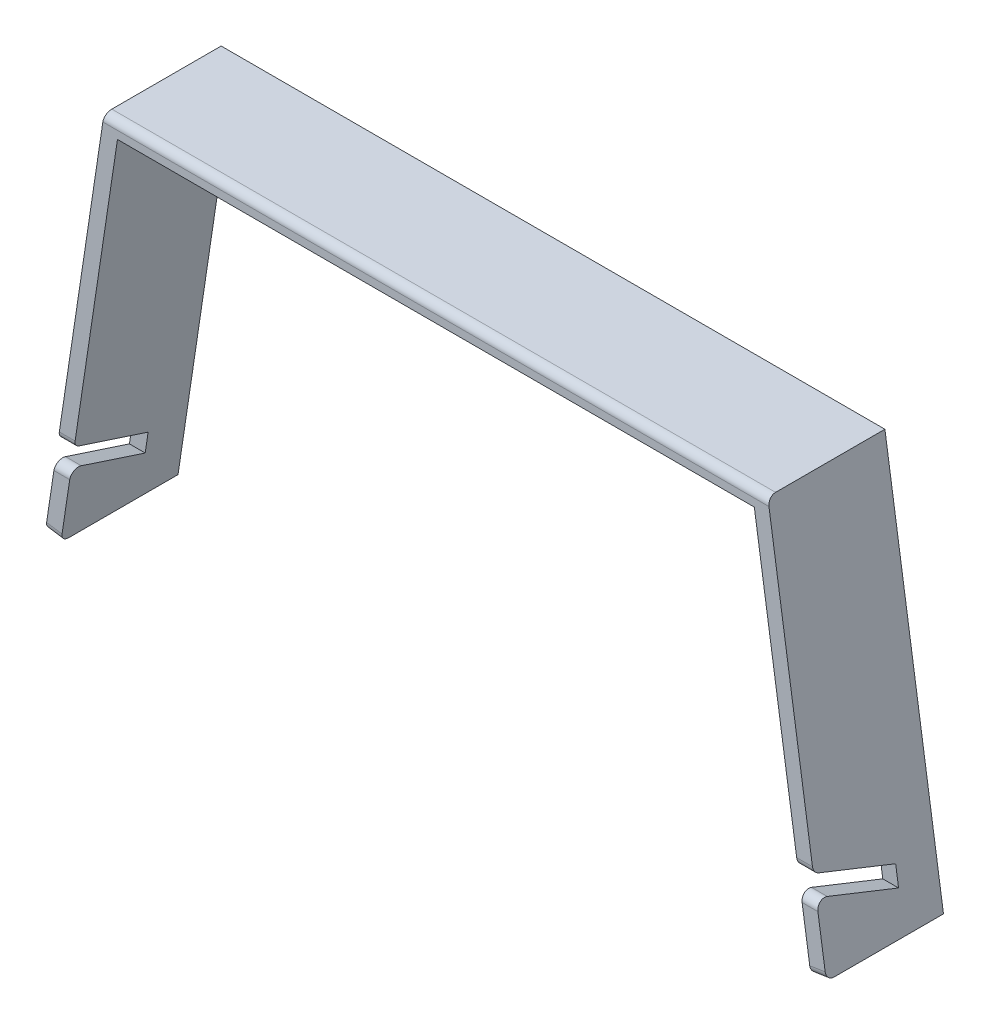
ISO-10303-21;
HEADER;
FILE_DESCRIPTION(('STEP AP214'),'2;1');
FILE_NAME('part.step','',(''),(''),'','','');
FILE_SCHEMA(('AUTOMOTIVE_DESIGN { 1 0 10303 214 1 1 1 1 }'));
ENDSEC;
DATA;
#1=APPLICATION_CONTEXT('core data for automotive mechanical design processes');
#2=APPLICATION_PROTOCOL_DEFINITION('international standard','automotive_design',2000,#1);
#3=PRODUCT_CONTEXT('',#1,'mechanical');
#4=PRODUCT('Part','Part','',(#3));
#5=PRODUCT_RELATED_PRODUCT_CATEGORY('part','',(#4));
#6=PRODUCT_DEFINITION_FORMATION('','',#4);
#7=PRODUCT_DEFINITION_CONTEXT('part definition',#1,'design');
#8=PRODUCT_DEFINITION('design','',#6,#7);
#9=PRODUCT_DEFINITION_SHAPE('','',#8);
#10=(LENGTH_UNIT() NAMED_UNIT(*) SI_UNIT(.MILLI.,.METRE.));
#11=(NAMED_UNIT(*) PLANE_ANGLE_UNIT() SI_UNIT($,.RADIAN.));
#12=(NAMED_UNIT(*) SI_UNIT($,.STERADIAN.) SOLID_ANGLE_UNIT());
#13=UNCERTAINTY_MEASURE_WITH_UNIT(LENGTH_MEASURE(1.E-05),#10,'distance_accuracy_value','');
#14=(GEOMETRIC_REPRESENTATION_CONTEXT(3) GLOBAL_UNCERTAINTY_ASSIGNED_CONTEXT((#13)) GLOBAL_UNIT_ASSIGNED_CONTEXT((#10,
#11,#12)) REPRESENTATION_CONTEXT('',''));
#15=CARTESIAN_POINT('',(0.,0.,0.));
#16=DIRECTION('',(0.,0.,1.));
#17=DIRECTION('',(1.,0.,0.));
#18=AXIS2_PLACEMENT_3D('',#15,#16,#17);
#19=CARTESIAN_POINT('',(0.,0.,15.));
#20=DIRECTION('',(0.,0.,-1.));
#21=DIRECTION('',(-1.,0.,0.));
#22=AXIS2_PLACEMENT_3D('',#19,#20,#21);
#23=PLANE('',#22);
#24=DIRECTION('',(0.148340452930245,0.988936352868298,0.));
#25=VECTOR('',#24,1.);
#26=CARTESIAN_POINT('',(-50.,0.,15.));
#27=LINE('',#26,#25);
#28=CARTESIAN_POINT('',(-48.2240135178692,11.8399098808718,15.));
#29=VERTEX_POINT('',#28);
#30=CARTESIAN_POINT('',(-42.65,49.,15.));
#31=VERTEX_POINT('',#30);
#32=EDGE_CURVE('E244',#29,#31,#27,.T.);
#33=ORIENTED_EDGE('',*,*,#32,.F.);
#34=DIRECTION('',(1.,0.,0.));
#35=VECTOR('',#34,1.);
#36=CARTESIAN_POINT('',(0.,11.8399098808718,15.));
#37=LINE('',#36,#35);
#38=CARTESIAN_POINT('',(-46.2016386762536,11.8399098808718,15.));
#39=VERTEX_POINT('',#38);
#40=EDGE_CURVE('E339',#29,#39,#37,.T.);
#41=ORIENTED_EDGE('',*,*,#40,.T.);
#42=DIRECTION('',(0.148340452930245,0.988936352868298,0.));
#43=VECTOR('',#42,1.);
#44=CARTESIAN_POINT('',(-48.0221272942634,-0.296680905860489,15.));
#45=LINE('',#44,#43);
#46=CARTESIAN_POINT('',(-40.7776251583843,48.,15.));
#47=VERTEX_POINT('',#46);
#48=EDGE_CURVE('E247',#39,#47,#45,.T.);
#49=ORIENTED_EDGE('',*,*,#48,.T.);
#50=DIRECTION('',(1.,0.,0.));
#51=VECTOR('',#50,1.);
#52=CARTESIAN_POINT('',(-42.5,48.,15.));
#53=LINE('',#52,#51);
#54=CARTESIAN_POINT('',(40.7776251583843,48.,15.));
#55=VERTEX_POINT('',#54);
#56=EDGE_CURVE('E251',#47,#55,#53,.T.);
#57=ORIENTED_EDGE('',*,*,#56,.T.);
#58=DIRECTION('',(0.148340452930245,-0.988936352868298,0.));
#59=VECTOR('',#58,1.);
#60=CARTESIAN_POINT('',(40.5221272942634,49.7033190941395,15.));
#61=LINE('',#60,#59);
#62=CARTESIAN_POINT('',(46.2016386762536,11.8399098808718,15.));
#63=VERTEX_POINT('',#62);
#64=EDGE_CURVE('E237',#55,#63,#61,.T.);
#65=ORIENTED_EDGE('',*,*,#64,.T.);
#66=DIRECTION('',(1.,0.,0.));
#67=VECTOR('',#66,1.);
#68=CARTESIAN_POINT('',(0.,11.8399098808718,15.));
#69=LINE('',#68,#67);
#70=CARTESIAN_POINT('',(48.2240135178693,11.8399098808718,15.));
#71=VERTEX_POINT('',#70);
#72=EDGE_CURVE('E336',#63,#71,#69,.T.);
#73=ORIENTED_EDGE('',*,*,#72,.T.);
#74=DIRECTION('',(0.148340452930245,-0.988936352868298,0.));
#75=VECTOR('',#74,1.);
#76=CARTESIAN_POINT('',(42.5,50.,15.));
#77=LINE('',#76,#75);
#78=CARTESIAN_POINT('',(42.65,49.,15.));
#79=VERTEX_POINT('',#78);
#80=EDGE_CURVE('E242',#79,#71,#77,.T.);
#81=ORIENTED_EDGE('',*,*,#80,.F.);
#82=DIRECTION('',(1.,0.,0.));
#83=VECTOR('',#82,1.);
#84=CARTESIAN_POINT('',(-42.5,49.,15.));
#85=LINE('',#84,#83);
#86=EDGE_CURVE('E304',#79,#31,#85,.F.);
#87=ORIENTED_EDGE('',*,*,#86,.T.);
#88=EDGE_LOOP('',(#33,#41,#49,#57,#65,#73,#81,#87));
#89=FACE_BOUND('',#88,.T.);
#90=ADVANCED_FACE('F33',(#89),#23,.F.);
#91=CARTESIAN_POINT('',(48.918266849612,7.21155433591995,15.));
#92=VERTEX_POINT('',#91);
#93=CARTESIAN_POINT('',(49.8516595470698,0.988936352868307,15.));
#94=VERTEX_POINT('',#93);
#95=EDGE_CURVE('E240',#92,#94,#77,.T.);
#96=ORIENTED_EDGE('',*,*,#95,.F.);
#97=DIRECTION('',(-1.,0.,0.));
#98=VECTOR('',#97,1.);
#99=CARTESIAN_POINT('',(0.,7.21155433591995,15.));
#100=LINE('',#99,#98);
#101=CARTESIAN_POINT('',(46.8958920079964,7.21155433591995,15.));
#102=VERTEX_POINT('',#101);
#103=EDGE_CURVE('E344',#92,#102,#100,.T.);
#104=ORIENTED_EDGE('',*,*,#103,.T.);
#105=CARTESIAN_POINT('',(47.8737868413332,0.692255447007829,15.));
#106=VERTEX_POINT('',#105);
#107=EDGE_CURVE('E241',#102,#106,#61,.T.);
#108=ORIENTED_EDGE('',*,*,#107,.T.);
#109=DIRECTION('',(-0.988936352868298,-0.148340452930245,0.));
#110=VECTOR('',#109,1.);
#111=CARTESIAN_POINT('',(49.8516595470698,0.98893635286831,15.));
#112=LINE('',#111,#110);
#113=EDGE_CURVE('E301',#106,#94,#112,.F.);
#114=ORIENTED_EDGE('',*,*,#113,.T.);
#115=EDGE_LOOP('',(#96,#104,#108,#114));
#116=FACE_BOUND('',#115,.T.);
#117=ADVANCED_FACE('F359',(#116),#23,.F.);
#118=CARTESIAN_POINT('',(40.5221272942634,49.7033190941395,15.));
#119=DIRECTION('',(0.988936352868297,0.148340452930245,0.));
#120=DIRECTION('',(-0.148340452930245,0.988936352868298,0.));
#121=AXIS2_PLACEMENT_3D('',#118,#119,#120);
#122=PLANE('',#121);
#123=ORIENTED_EDGE('',*,*,#107,.F.);
#124=CARTESIAN_POINT('',(46.8958920079964,7.21155433591995,14.));
#125=DIRECTION('',(0.988936352868297,0.148340452930245,0.));
#126=DIRECTION('',(-0.148340452930245,0.988936352868298,0.));
#127=AXIS2_PLACEMENT_3D('',#124,#125,#126);
#128=ELLIPSE('',#127,1.01118742080783,1.);
#129=CARTESIAN_POINT('',(46.7549381148785,8.15124695670587,13.6579798566743));
#130=VERTEX_POINT('',#129);
#131=EDGE_CURVE('E349',#102,#130,#128,.F.);
#132=ORIENTED_EDGE('',*,*,#131,.T.);
#133=DIRECTION('',(0.0512356397047028,-0.341570931364685,-0.938458421066544));
#134=VECTOR('',#133,1.);
#135=CARTESIAN_POINT('',(45.9468623050078,13.5384190225104,28.4591134621887));
#136=LINE('',#135,#134);
#137=CARTESIAN_POINT('',(47.2276251583844,5.00000000000001,5.));
#138=VERTEX_POINT('',#137);
#139=EDGE_CURVE('E219',#130,#138,#136,.T.);
#140=ORIENTED_EDGE('',*,*,#139,.T.);
#141=DIRECTION('',(-0.148340452930245,0.988936352868298,0.));
#142=VECTOR('',#141,1.);
#143=CARTESIAN_POINT('',(40.5221272942634,49.7033190941395,5.));
#144=LINE('',#143,#142);
#145=CARTESIAN_POINT('',(46.8526251583843,7.5,5.));
#146=VERTEX_POINT('',#145);
#147=EDGE_CURVE('E233',#138,#146,#144,.T.);
#148=ORIENTED_EDGE('',*,*,#147,.T.);
#149=DIRECTION('',(-0.0512356397047028,0.341570931364685,0.938458421066544));
#150=VECTOR('',#149,1.);
#151=CARTESIAN_POINT('',(45.6165982269813,15.7401795426871,27.6397072257846));
#152=LINE('',#151,#150);
#153=CARTESIAN_POINT('',(46.3425925693715,10.9002172600859,14.3420201433257));
#154=VERTEX_POINT('',#153);
#155=EDGE_CURVE('E202',#146,#154,#152,.T.);
#156=ORIENTED_EDGE('',*,*,#155,.T.);
#157=CARTESIAN_POINT('',(46.2016386762536,11.8399098808718,14.));
#158=DIRECTION('',(0.988936352868297,0.148340452930245,0.));
#159=DIRECTION('',(0.148340452930245,-0.988936352868298,0.));
#160=AXIS2_PLACEMENT_3D('',#157,#158,#159);
#161=ELLIPSE('',#160,1.01118742080783,1.);
#162=EDGE_CURVE('E347',#154,#63,#161,.F.);
#163=ORIENTED_EDGE('',*,*,#162,.T.);
#164=ORIENTED_EDGE('',*,*,#64,.F.);
#165=DIRECTION('',(0.,0.,-1.));
#166=VECTOR('',#165,1.);
#167=CARTESIAN_POINT('',(40.7776251583843,48.,15.));
#168=LINE('',#167,#166);
#169=CARTESIAN_POINT('',(40.7776251583843,48.,0.));
#170=VERTEX_POINT('',#169);
#171=EDGE_CURVE('E253',#55,#170,#168,.T.);
#172=ORIENTED_EDGE('',*,*,#171,.T.);
#173=DIRECTION('',(0.148340452930245,-0.988936352868298,0.));
#174=VECTOR('',#173,1.);
#175=CARTESIAN_POINT('',(40.5221272942634,49.7033190941395,0.));
#176=LINE('',#175,#174);
#177=CARTESIAN_POINT('',(48.0221272942634,-0.296680905860477,0.));
#178=VERTEX_POINT('',#177);
#179=EDGE_CURVE('E236',#170,#178,#176,.T.);
#180=ORIENTED_EDGE('',*,*,#179,.T.);
#181=DIRECTION('',(0.,0.,-1.));
#182=VECTOR('',#181,1.);
#183=CARTESIAN_POINT('',(48.0221272942634,-0.296680905860477,15.));
#184=LINE('',#183,#182);
#185=CARTESIAN_POINT('',(48.0221272942634,-0.296680905860477,14.));
#186=VERTEX_POINT('',#185);
#187=EDGE_CURVE('E290',#186,#178,#184,.T.);
#188=ORIENTED_EDGE('',*,*,#187,.F.);
#189=CARTESIAN_POINT('',(47.8737868413332,0.69225544700782,14.));
#190=DIRECTION('',(0.988936352868297,0.148340452930245,0.));
#191=DIRECTION('',(-0.148340452930245,0.988936352868298,0.));
#192=AXIS2_PLACEMENT_3D('',#189,#190,#191);
#193=CIRCLE('',#192,1.);
#194=EDGE_CURVE('E314',#186,#106,#193,.F.);
#195=ORIENTED_EDGE('',*,*,#194,.T.);
#196=EDGE_LOOP('',(#123,#132,#140,#148,#156,#163,#164,#172,#180,#188,#195));
#197=FACE_BOUND('',#196,.T.);
#198=ADVANCED_FACE('F365',(#197),#122,.F.);
#199=CARTESIAN_POINT('',(50.,0.,15.));
#200=DIRECTION('',(0.148340452930245,-0.988936352868297,0.));
#201=DIRECTION('',(0.988936352868298,0.148340452930245,0.));
#202=AXIS2_PLACEMENT_3D('',#199,#200,#201);
#203=PLANE('',#202);
#204=DIRECTION('',(0.,0.,-1.));
#205=VECTOR('',#204,1.);
#206=CARTESIAN_POINT('',(50.,0.,15.));
#207=LINE('',#206,#205);
#208=CARTESIAN_POINT('',(50.,0.,14.));
#209=VERTEX_POINT('',#208);
#210=CARTESIAN_POINT('',(50.,0.,0.));
#211=VERTEX_POINT('',#210);
#212=EDGE_CURVE('E288',#209,#211,#207,.T.);
#213=ORIENTED_EDGE('',*,*,#212,.F.);
#214=DIRECTION('',(-0.988936352868298,-0.148340452930245,0.));
#215=VECTOR('',#214,1.);
#216=CARTESIAN_POINT('',(48.0221272942634,-0.296680905860477,14.));
#217=LINE('',#216,#215);
#218=EDGE_CURVE('E311',#209,#186,#217,.T.);
#219=ORIENTED_EDGE('',*,*,#218,.T.);
#220=ORIENTED_EDGE('',*,*,#187,.T.);
#221=DIRECTION('',(-0.988936352868298,-0.148340452930245,0.));
#222=VECTOR('',#221,1.);
#223=CARTESIAN_POINT('',(50.,0.,0.));
#224=LINE('',#223,#222);
#225=EDGE_CURVE('E256',#211,#178,#224,.T.);
#226=ORIENTED_EDGE('',*,*,#225,.F.);
#227=EDGE_LOOP('',(#213,#219,#220,#226));
#228=FACE_BOUND('',#227,.T.);
#229=ADVANCED_FACE('F533',(#228),#203,.T.);
#230=CARTESIAN_POINT('',(42.5,50.,15.));
#231=DIRECTION('',(0.988936352868297,0.148340452930245,0.));
#232=DIRECTION('',(-0.148340452930245,0.988936352868298,0.));
#233=AXIS2_PLACEMENT_3D('',#230,#231,#232);
#234=PLANE('',#233);
#235=DIRECTION('',(0.0512356397047028,-0.341570931364685,-0.938458421066544));
#236=VECTOR('',#235,1.);
#237=CARTESIAN_POINT('',(47.9639282290812,13.5738118061253,28.5563543359824));
#238=LINE('',#237,#236);
#239=CARTESIAN_POINT('',(48.7773129564941,8.15124695670587,13.6579798566743));
#240=VERTEX_POINT('',#239);
#241=CARTESIAN_POINT('',(49.25,5.00000000000001,5.));
#242=VERTEX_POINT('',#241);
#243=EDGE_CURVE('E217',#240,#242,#238,.T.);
#244=ORIENTED_EDGE('',*,*,#243,.F.);
#245=CARTESIAN_POINT('',(48.918266849612,7.21155433591995,14.));
#246=DIRECTION('',(0.988936352868297,0.148340452930245,0.));
#247=DIRECTION('',(-0.148340452930245,0.988936352868298,0.));
#248=AXIS2_PLACEMENT_3D('',#245,#246,#247);
#249=ELLIPSE('',#248,1.01118742080783,1.);
#250=EDGE_CURVE('E41',#240,#92,#249,.T.);
#251=ORIENTED_EDGE('',*,*,#250,.T.);
#252=ORIENTED_EDGE('',*,*,#95,.T.);
#253=CARTESIAN_POINT('',(49.8516595470698,0.98893635286831,14.));
#254=DIRECTION('',(0.988936352868297,0.148340452930245,0.));
#255=DIRECTION('',(-0.148340452930245,0.988936352868298,0.));
#256=AXIS2_PLACEMENT_3D('',#253,#254,#255);
#257=CIRCLE('',#256,1.);
#258=EDGE_CURVE('E295',#94,#209,#257,.T.);
#259=ORIENTED_EDGE('',*,*,#258,.T.);
#260=ORIENTED_EDGE('',*,*,#212,.T.);
#261=DIRECTION('',(0.148340452930245,-0.988936352868298,0.));
#262=VECTOR('',#261,1.);
#263=CARTESIAN_POINT('',(42.5,50.,0.));
#264=LINE('',#263,#262);
#265=CARTESIAN_POINT('',(42.5,50.,0.));
#266=VERTEX_POINT('',#265);
#267=EDGE_CURVE('E259',#266,#211,#264,.T.);
#268=ORIENTED_EDGE('',*,*,#267,.F.);
#269=DIRECTION('',(0.,0.,-1.));
#270=VECTOR('',#269,1.);
#271=CARTESIAN_POINT('',(42.5,50.,15.));
#272=LINE('',#271,#270);
#273=CARTESIAN_POINT('',(42.5,50.,14.));
#274=VERTEX_POINT('',#273);
#275=EDGE_CURVE('E286',#274,#266,#272,.T.);
#276=ORIENTED_EDGE('',*,*,#275,.F.);
#277=CARTESIAN_POINT('',(42.65,49.,14.));
#278=DIRECTION('',(0.988936352868297,0.148340452930245,0.));
#279=DIRECTION('',(-0.148340452930245,0.988936352868298,0.));
#280=AXIS2_PLACEMENT_3D('',#277,#278,#279);
#281=ELLIPSE('',#280,1.01118742080783,1.);
#282=EDGE_CURVE('E297',#274,#79,#281,.T.);
#283=ORIENTED_EDGE('',*,*,#282,.T.);
#284=ORIENTED_EDGE('',*,*,#80,.T.);
#285=CARTESIAN_POINT('',(48.2240135178692,11.8399098808718,14.));
#286=DIRECTION('',(0.988936352868297,0.148340452930245,0.));
#287=DIRECTION('',(0.148340452930245,-0.988936352868298,0.));
#288=AXIS2_PLACEMENT_3D('',#285,#286,#287);
#289=ELLIPSE('',#288,1.01118742080783,1.);
#290=CARTESIAN_POINT('',(48.3649674109871,10.9002172600859,14.3420201433257));
#291=VERTEX_POINT('',#290);
#292=EDGE_CURVE('E48',#71,#291,#289,.T.);
#293=ORIENTED_EDGE('',*,*,#292,.T.);
#294=DIRECTION('',(-0.0512356397047028,0.341570931364685,0.938458421066544));
#295=VECTOR('',#294,1.);
#296=CARTESIAN_POINT('',(47.6336641510547,15.7755723263021,27.7369480995782));
#297=LINE('',#296,#295);
#298=CARTESIAN_POINT('',(48.875,7.5,5.));
#299=VERTEX_POINT('',#298);
#300=EDGE_CURVE('E228',#299,#291,#297,.T.);
#301=ORIENTED_EDGE('',*,*,#300,.F.);
#302=DIRECTION('',(-0.148340452930245,0.988936352868298,0.));
#303=VECTOR('',#302,1.);
#304=CARTESIAN_POINT('',(42.5,50.,5.));
#305=LINE('',#304,#303);
#306=EDGE_CURVE('E201',#242,#299,#305,.T.);
#307=ORIENTED_EDGE('',*,*,#306,.F.);
#308=EDGE_LOOP('',(#244,#251,#252,#259,#260,#268,#276,#283,#284,#293,#301,#307));
#309=FACE_BOUND('',#308,.T.);
#310=ADVANCED_FACE('F354',(#309),#234,.T.);
#311=CARTESIAN_POINT('',(-42.5,50.,15.));
#312=DIRECTION('',(0.,1.,0.));
#313=DIRECTION('',(-1.,0.,0.));
#314=AXIS2_PLACEMENT_3D('',#311,#312,#313);
#315=PLANE('',#314);
#316=DIRECTION('',(0.,0.,-1.));
#317=VECTOR('',#316,1.);
#318=CARTESIAN_POINT('',(-42.5,50.,15.));
#319=LINE('',#318,#317);
#320=CARTESIAN_POINT('',(-42.5,50.,14.));
#321=VERTEX_POINT('',#320);
#322=CARTESIAN_POINT('',(-42.5,50.,0.));
#323=VERTEX_POINT('',#322);
#324=EDGE_CURVE('E284',#321,#323,#319,.T.);
#325=ORIENTED_EDGE('',*,*,#324,.F.);
#326=DIRECTION('',(1.,0.,0.));
#327=VECTOR('',#326,1.);
#328=CARTESIAN_POINT('',(42.5,50.,14.));
#329=LINE('',#328,#327);
#330=EDGE_CURVE('E292',#321,#274,#329,.T.);
#331=ORIENTED_EDGE('',*,*,#330,.T.);
#332=ORIENTED_EDGE('',*,*,#275,.T.);
#333=DIRECTION('',(1.,0.,0.));
#334=VECTOR('',#333,1.);
#335=CARTESIAN_POINT('',(-42.5,50.,0.));
#336=LINE('',#335,#334);
#337=EDGE_CURVE('E262',#323,#266,#336,.T.);
#338=ORIENTED_EDGE('',*,*,#337,.F.);
#339=EDGE_LOOP('',(#325,#331,#332,#338));
#340=FACE_BOUND('',#339,.T.);
#341=ADVANCED_FACE('F522',(#340),#315,.T.);
#342=CARTESIAN_POINT('',(-50.,0.,15.));
#343=DIRECTION('',(-0.988936352868298,0.148340452930245,0.));
#344=DIRECTION('',(-0.148340452930245,-0.988936352868298,0.));
#345=AXIS2_PLACEMENT_3D('',#342,#343,#344);
#346=PLANE('',#345);
#347=CARTESIAN_POINT('',(-49.8516595470698,0.988936352868298,15.));
#348=VERTEX_POINT('',#347);
#349=CARTESIAN_POINT('',(-48.918266849612,7.21155433591995,15.));
#350=VERTEX_POINT('',#349);
#351=EDGE_CURVE('E245',#348,#350,#27,.T.);
#352=ORIENTED_EDGE('',*,*,#351,.T.);
#353=CARTESIAN_POINT('',(-48.918266849612,7.21155433591995,14.));
#354=DIRECTION('',(-0.988936352868298,0.148340452930245,0.));
#355=DIRECTION('',(-0.148340452930245,-0.988936352868298,0.));
#356=AXIS2_PLACEMENT_3D('',#353,#354,#355);
#357=ELLIPSE('',#356,1.01118742080783,1.);
#358=CARTESIAN_POINT('',(-48.7773129564941,8.15124695670586,13.6579798566743));
#359=VERTEX_POINT('',#358);
#360=EDGE_CURVE('E216',#350,#359,#357,.T.);
#361=ORIENTED_EDGE('',*,*,#360,.T.);
#362=DIRECTION('',(0.0512356397047027,0.341570931364685,0.938458421066544));
#363=VECTOR('',#362,1.);
#364=CARTESIAN_POINT('',(-48.8586466685509,7.60902220966087,12.1682296078988));
#365=LINE('',#364,#363);
#366=CARTESIAN_POINT('',(-49.25,5.,5.));
#367=VERTEX_POINT('',#366);
#368=EDGE_CURVE('E207',#367,#359,#365,.T.);
#369=ORIENTED_EDGE('',*,*,#368,.F.);
#370=DIRECTION('',(-0.148340452930245,-0.988936352868298,0.));
#371=VECTOR('',#370,1.);
#372=CARTESIAN_POINT('',(-50.,0.,5.));
#373=LINE('',#372,#371);
#374=CARTESIAN_POINT('',(-48.875,7.5,5.));
#375=VERTEX_POINT('',#374);
#376=EDGE_CURVE('E190',#375,#367,#373,.T.);
#377=ORIENTED_EDGE('',*,*,#376,.F.);
#378=DIRECTION('',(-0.0512356397047027,-0.341570931364685,-0.938458421066544));
#379=VECTOR('',#378,1.);
#380=CARTESIAN_POINT('',(-48.5283825905244,9.81078272983765,11.3488233714946));
#381=LINE('',#380,#379);
#382=CARTESIAN_POINT('',(-48.3649674109871,10.9002172600859,14.3420201433257));
#383=VERTEX_POINT('',#382);
#384=EDGE_CURVE('E226',#383,#375,#381,.T.);
#385=ORIENTED_EDGE('',*,*,#384,.F.);
#386=CARTESIAN_POINT('',(-48.2240135178692,11.8399098808718,14.));
#387=DIRECTION('',(-0.988936352868298,0.148340452930245,0.));
#388=DIRECTION('',(0.148340452930245,0.988936352868298,0.));
#389=AXIS2_PLACEMENT_3D('',#386,#387,#388);
#390=ELLIPSE('',#389,1.01118742080783,1.);
#391=EDGE_CURVE('E327',#383,#29,#390,.T.);
#392=ORIENTED_EDGE('',*,*,#391,.T.);
#393=ORIENTED_EDGE('',*,*,#32,.T.);
#394=CARTESIAN_POINT('',(-42.65,49.,14.));
#395=DIRECTION('',(-0.988936352868298,0.148340452930245,0.));
#396=DIRECTION('',(-0.148340452930245,-0.988936352868298,0.));
#397=AXIS2_PLACEMENT_3D('',#394,#395,#396);
#398=ELLIPSE('',#397,1.01118742080783,1.);
#399=EDGE_CURVE('E309',#31,#321,#398,.T.);
#400=ORIENTED_EDGE('',*,*,#399,.T.);
#401=ORIENTED_EDGE('',*,*,#324,.T.);
#402=DIRECTION('',(0.148340452930245,0.988936352868298,0.));
#403=VECTOR('',#402,1.);
#404=CARTESIAN_POINT('',(-50.,0.,0.));
#405=LINE('',#404,#403);
#406=CARTESIAN_POINT('',(-50.,0.,0.));
#407=VERTEX_POINT('',#406);
#408=EDGE_CURVE('E265',#407,#323,#405,.T.);
#409=ORIENTED_EDGE('',*,*,#408,.F.);
#410=DIRECTION('',(0.,0.,-1.));
#411=VECTOR('',#410,1.);
#412=CARTESIAN_POINT('',(-50.,0.,15.));
#413=LINE('',#412,#411);
#414=CARTESIAN_POINT('',(-50.,0.,14.));
#415=VERTEX_POINT('',#414);
#416=EDGE_CURVE('E282',#415,#407,#413,.T.);
#417=ORIENTED_EDGE('',*,*,#416,.F.);
#418=CARTESIAN_POINT('',(-49.8516595470698,0.988936352868298,14.));
#419=DIRECTION('',(-0.988936352868298,0.148340452930245,0.));
#420=DIRECTION('',(-0.148340452930245,-0.988936352868298,0.));
#421=AXIS2_PLACEMENT_3D('',#418,#419,#420);
#422=CIRCLE('',#421,1.);
#423=EDGE_CURVE('E307',#415,#348,#422,.T.);
#424=ORIENTED_EDGE('',*,*,#423,.T.);
#425=EDGE_LOOP('',(#352,#361,#369,#377,#385,#392,#393,#400,#401,#409,#417,#424));
#426=FACE_BOUND('',#425,.T.);
#427=ADVANCED_FACE('F215',(#426),#346,.T.);
#428=CARTESIAN_POINT('',(-48.0221272942634,-0.296680905860489,15.));
#429=DIRECTION('',(-0.148340452930245,-0.988936352868297,0.));
#430=DIRECTION('',(0.988936352868298,-0.148340452930245,0.));
#431=AXIS2_PLACEMENT_3D('',#428,#429,#430);
#432=PLANE('',#431);
#433=DIRECTION('',(0.,0.,-1.));
#434=VECTOR('',#433,1.);
#435=CARTESIAN_POINT('',(-48.0221272942634,-0.296680905860489,15.));
#436=LINE('',#435,#434);
#437=CARTESIAN_POINT('',(-48.0221272942634,-0.296680905860489,14.));
#438=VERTEX_POINT('',#437);
#439=CARTESIAN_POINT('',(-48.0221272942634,-0.296680905860489,0.));
#440=VERTEX_POINT('',#439);
#441=EDGE_CURVE('E280',#438,#440,#436,.T.);
#442=ORIENTED_EDGE('',*,*,#441,.F.);
#443=DIRECTION('',(-0.988936352868298,0.148340452930245,0.));
#444=VECTOR('',#443,1.);
#445=CARTESIAN_POINT('',(-50.,0.,14.));
#446=LINE('',#445,#444);
#447=EDGE_CURVE('E317',#438,#415,#446,.T.);
#448=ORIENTED_EDGE('',*,*,#447,.T.);
#449=ORIENTED_EDGE('',*,*,#416,.T.);
#450=DIRECTION('',(-0.988936352868298,0.148340452930245,0.));
#451=VECTOR('',#450,1.);
#452=CARTESIAN_POINT('',(-48.0221272942634,-0.296680905860489,0.));
#453=LINE('',#452,#451);
#454=EDGE_CURVE('E268',#440,#407,#453,.T.);
#455=ORIENTED_EDGE('',*,*,#454,.F.);
#456=EDGE_LOOP('',(#442,#448,#449,#455));
#457=FACE_BOUND('',#456,.T.);
#458=ADVANCED_FACE('F511',(#457),#432,.T.);
#459=CARTESIAN_POINT('',(-48.0221272942634,-0.296680905860489,15.));
#460=DIRECTION('',(-0.988936352868298,0.148340452930245,0.));
#461=DIRECTION('',(-0.148340452930245,-0.988936352868298,0.));
#462=AXIS2_PLACEMENT_3D('',#459,#460,#461);
#463=PLANE('',#462);
#464=DIRECTION('',(0.0512356397047027,0.341570931364685,0.938458421066544));
#465=VECTOR('',#464,1.);
#466=CARTESIAN_POINT('',(-46.8415807444774,7.57362942604595,12.0709887341051));
#467=LINE('',#466,#465);
#468=CARTESIAN_POINT('',(-47.2276251583843,5.,5.));
#469=VERTEX_POINT('',#468);
#470=CARTESIAN_POINT('',(-46.7549381148785,8.15124695670586,13.6579798566743));
#471=VERTEX_POINT('',#470);
#472=EDGE_CURVE('E210',#469,#471,#467,.T.);
#473=ORIENTED_EDGE('',*,*,#472,.T.);
#474=CARTESIAN_POINT('',(-46.8958920079963,7.21155433591995,14.));
#475=DIRECTION('',(-0.988936352868298,0.148340452930245,0.));
#476=DIRECTION('',(-0.148340452930245,-0.988936352868298,0.));
#477=AXIS2_PLACEMENT_3D('',#474,#475,#476);
#478=ELLIPSE('',#477,1.01118742080783,1.);
#479=CARTESIAN_POINT('',(-46.8958920079963,7.21155433591995,15.));
#480=VERTEX_POINT('',#479);
#481=EDGE_CURVE('E334',#471,#480,#478,.F.);
#482=ORIENTED_EDGE('',*,*,#481,.T.);
#483=CARTESIAN_POINT('',(-47.8737868413332,0.692255447007808,15.));
#484=VERTEX_POINT('',#483);
#485=EDGE_CURVE('E248',#484,#480,#45,.T.);
#486=ORIENTED_EDGE('',*,*,#485,.F.);
#487=CARTESIAN_POINT('',(-47.8737868413332,0.692255447007808,14.));
#488=DIRECTION('',(-0.988936352868298,0.148340452930245,0.));
#489=DIRECTION('',(-0.148340452930245,-0.988936352868298,0.));
#490=AXIS2_PLACEMENT_3D('',#487,#488,#489);
#491=CIRCLE('',#490,1.);
#492=EDGE_CURVE('E320',#484,#438,#491,.F.);
#493=ORIENTED_EDGE('',*,*,#492,.T.);
#494=ORIENTED_EDGE('',*,*,#441,.T.);
#495=DIRECTION('',(0.148340452930245,0.988936352868298,0.));
#496=VECTOR('',#495,1.);
#497=CARTESIAN_POINT('',(-48.0221272942634,-0.296680905860489,0.));
#498=LINE('',#497,#496);
#499=CARTESIAN_POINT('',(-40.7776251583843,48.,0.));
#500=VERTEX_POINT('',#499);
#501=EDGE_CURVE('E271',#440,#500,#498,.T.);
#502=ORIENTED_EDGE('',*,*,#501,.T.);
#503=DIRECTION('',(0.,0.,-1.));
#504=VECTOR('',#503,1.);
#505=CARTESIAN_POINT('',(-40.7776251583843,48.,15.));
#506=LINE('',#505,#504);
#507=EDGE_CURVE('E277',#47,#500,#506,.T.);
#508=ORIENTED_EDGE('',*,*,#507,.F.);
#509=ORIENTED_EDGE('',*,*,#48,.F.);
#510=CARTESIAN_POINT('',(-46.2016386762536,11.8399098808718,14.));
#511=DIRECTION('',(-0.988936352868298,0.148340452930245,0.));
#512=DIRECTION('',(0.148340452930245,0.988936352868298,0.));
#513=AXIS2_PLACEMENT_3D('',#510,#511,#512);
#514=ELLIPSE('',#513,1.01118742080783,1.);
#515=CARTESIAN_POINT('',(-46.3425925693715,10.9002172600859,14.3420201433257));
#516=VERTEX_POINT('',#515);
#517=EDGE_CURVE('E332',#39,#516,#514,.F.);
#518=ORIENTED_EDGE('',*,*,#517,.T.);
#519=DIRECTION('',(-0.0512356397047027,-0.341570931364685,-0.938458421066544));
#520=VECTOR('',#519,1.);
#521=CARTESIAN_POINT('',(-46.5113166664509,9.77538994622273,11.2515824977009));
#522=LINE('',#521,#520);
#523=CARTESIAN_POINT('',(-46.8526251583843,7.5,5.));
#524=VERTEX_POINT('',#523);
#525=EDGE_CURVE('E224',#516,#524,#522,.T.);
#526=ORIENTED_EDGE('',*,*,#525,.T.);
#527=DIRECTION('',(-0.148340452930245,-0.988936352868298,0.));
#528=VECTOR('',#527,1.);
#529=CARTESIAN_POINT('',(-48.0221272942634,-0.296680905860489,5.));
#530=LINE('',#529,#528);
#531=EDGE_CURVE('E322',#524,#469,#530,.T.);
#532=ORIENTED_EDGE('',*,*,#531,.T.);
#533=EDGE_LOOP('',(#473,#482,#486,#493,#494,#502,#508,#509,#518,#526,#532));
#534=FACE_BOUND('',#533,.T.);
#535=ADVANCED_FACE('F388',(#534),#463,.F.);
#536=CARTESIAN_POINT('',(-42.5,48.,15.));
#537=DIRECTION('',(0.,1.,0.));
#538=DIRECTION('',(-1.,0.,0.));
#539=AXIS2_PLACEMENT_3D('',#536,#537,#538);
#540=PLANE('',#539);
#541=DIRECTION('',(1.,0.,0.));
#542=VECTOR('',#541,1.);
#543=CARTESIAN_POINT('',(-42.5,48.,0.));
#544=LINE('',#543,#542);
#545=EDGE_CURVE('E273',#500,#170,#544,.T.);
#546=ORIENTED_EDGE('',*,*,#545,.T.);
#547=ORIENTED_EDGE('',*,*,#171,.F.);
#548=ORIENTED_EDGE('',*,*,#56,.F.);
#549=ORIENTED_EDGE('',*,*,#507,.T.);
#550=EDGE_LOOP('',(#546,#547,#548,#549));
#551=FACE_BOUND('',#550,.T.);
#552=ADVANCED_FACE('F394',(#551),#540,.F.);
#553=ORIENTED_EDGE('',*,*,#485,.T.);
#554=DIRECTION('',(-1.,0.,0.));
#555=VECTOR('',#554,1.);
#556=CARTESIAN_POINT('',(0.,7.21155433591995,15.));
#557=LINE('',#556,#555);
#558=EDGE_CURVE('E324',#480,#350,#557,.T.);
#559=ORIENTED_EDGE('',*,*,#558,.T.);
#560=ORIENTED_EDGE('',*,*,#351,.F.);
#561=DIRECTION('',(-0.988936352868298,0.148340452930245,0.));
#562=VECTOR('',#561,1.);
#563=CARTESIAN_POINT('',(-47.8737868413332,0.692255447007808,15.));
#564=LINE('',#563,#562);
#565=EDGE_CURVE('E299',#348,#484,#564,.F.);
#566=ORIENTED_EDGE('',*,*,#565,.T.);
#567=EDGE_LOOP('',(#553,#559,#560,#566));
#568=FACE_BOUND('',#567,.T.);
#569=ADVANCED_FACE('F413',(#568),#23,.F.);
#570=CARTESIAN_POINT('',(0.,0.,0.));
#571=DIRECTION('',(0.,0.,-1.));
#572=DIRECTION('',(-1.,0.,0.));
#573=AXIS2_PLACEMENT_3D('',#570,#571,#572);
#574=PLANE('',#573);
#575=ORIENTED_EDGE('',*,*,#179,.F.);
#576=ORIENTED_EDGE('',*,*,#545,.F.);
#577=ORIENTED_EDGE('',*,*,#501,.F.);
#578=ORIENTED_EDGE('',*,*,#454,.T.);
#579=ORIENTED_EDGE('',*,*,#408,.T.);
#580=ORIENTED_EDGE('',*,*,#337,.T.);
#581=ORIENTED_EDGE('',*,*,#267,.T.);
#582=ORIENTED_EDGE('',*,*,#225,.T.);
#583=EDGE_LOOP('',(#575,#576,#577,#578,#579,#580,#581,#582));
#584=FACE_BOUND('',#583,.T.);
#585=ADVANCED_FACE('F419',(#584),#574,.T.);
#586=CARTESIAN_POINT('',(-42.5,49.,14.));
#587=DIRECTION('',(-1.,0.,0.));
#588=DIRECTION('',(0.,-1.,0.));
#589=AXIS2_PLACEMENT_3D('',#586,#587,#588);
#590=CYLINDRICAL_SURFACE('',#589,1.);
#591=ORIENTED_EDGE('',*,*,#399,.F.);
#592=ORIENTED_EDGE('',*,*,#86,.F.);
#593=ORIENTED_EDGE('',*,*,#282,.F.);
#594=ORIENTED_EDGE('',*,*,#330,.F.);
#595=EDGE_LOOP('',(#591,#592,#593,#594));
#596=FACE_BOUND('',#595,.T.);
#597=ADVANCED_FACE('F425',(#596),#590,.T.);
#598=CARTESIAN_POINT('',(49.8516595470698,0.98893635286831,14.));
#599=DIRECTION('',(0.988936352868298,0.148340452930245,0.));
#600=DIRECTION('',(-0.148340452930245,0.988936352868298,0.));
#601=AXIS2_PLACEMENT_3D('',#598,#599,#600);
#602=CYLINDRICAL_SURFACE('',#601,1.);
#603=ORIENTED_EDGE('',*,*,#258,.F.);
#604=ORIENTED_EDGE('',*,*,#113,.F.);
#605=ORIENTED_EDGE('',*,*,#194,.F.);
#606=ORIENTED_EDGE('',*,*,#218,.F.);
#607=EDGE_LOOP('',(#603,#604,#605,#606));
#608=FACE_BOUND('',#607,.T.);
#609=ADVANCED_FACE('F568',(#608),#602,.T.);
#610=CARTESIAN_POINT('',(-47.8737868413332,0.692255447007808,14.));
#611=DIRECTION('',(0.988936352868298,-0.148340452930245,0.));
#612=DIRECTION('',(0.148340452930245,0.988936352868298,0.));
#613=AXIS2_PLACEMENT_3D('',#610,#611,#612);
#614=CYLINDRICAL_SURFACE('',#613,1.);
#615=ORIENTED_EDGE('',*,*,#492,.F.);
#616=ORIENTED_EDGE('',*,*,#565,.F.);
#617=ORIENTED_EDGE('',*,*,#423,.F.);
#618=ORIENTED_EDGE('',*,*,#447,.F.);
#619=EDGE_LOOP('',(#615,#616,#617,#618));
#620=FACE_BOUND('',#619,.T.);
#621=ADVANCED_FACE('F444',(#620),#614,.T.);
#622=CARTESIAN_POINT('',(-50.,5.,5.));
#623=DIRECTION('',(0.,-0.939692620785907,0.342020143325672));
#624=DIRECTION('',(0.,-0.342020143325672,-0.939692620785907));
#625=AXIS2_PLACEMENT_3D('',#622,#623,#624);
#626=PLANE('',#625);
#627=ORIENTED_EDGE('',*,*,#368,.T.);
#628=DIRECTION('',(-1.,0.,0.));
#629=VECTOR('',#628,1.);
#630=CARTESIAN_POINT('',(-50.,8.15124695670586,13.6579798566743));
#631=LINE('',#630,#629);
#632=EDGE_CURVE('E330',#359,#471,#631,.F.);
#633=ORIENTED_EDGE('',*,*,#632,.T.);
#634=ORIENTED_EDGE('',*,*,#472,.F.);
#635=DIRECTION('',(1.,0.,0.));
#636=VECTOR('',#635,1.);
#637=CARTESIAN_POINT('',(-50.,5.,5.));
#638=LINE('',#637,#636);
#639=EDGE_CURVE('E194',#367,#469,#638,.T.);
#640=ORIENTED_EDGE('',*,*,#639,.F.);
#641=EDGE_LOOP('',(#627,#633,#634,#640));
#642=FACE_BOUND('',#641,.T.);
#643=ADVANCED_FACE('F206',(#642),#626,.F.);
#644=CARTESIAN_POINT('',(-50.,11.1397023426621,15.));
#645=DIRECTION('',(0.,0.939692620785907,-0.342020143325672));
#646=DIRECTION('',(0.,0.342020143325672,0.939692620785907));
#647=AXIS2_PLACEMENT_3D('',#644,#645,#646);
#648=PLANE('',#647);
#649=ORIENTED_EDGE('',*,*,#525,.F.);
#650=DIRECTION('',(1.,0.,0.));
#651=VECTOR('',#650,1.);
#652=CARTESIAN_POINT('',(-50.,10.9002172600859,14.3420201433257));
#653=LINE('',#652,#651);
#654=EDGE_CURVE('E342',#516,#383,#653,.F.);
#655=ORIENTED_EDGE('',*,*,#654,.T.);
#656=ORIENTED_EDGE('',*,*,#384,.T.);
#657=DIRECTION('',(1.,0.,0.));
#658=VECTOR('',#657,1.);
#659=CARTESIAN_POINT('',(-50.,7.5,5.));
#660=LINE('',#659,#658);
#661=EDGE_CURVE('E197',#375,#524,#660,.T.);
#662=ORIENTED_EDGE('',*,*,#661,.T.);
#663=EDGE_LOOP('',(#649,#655,#656,#662));
#664=FACE_BOUND('',#663,.T.);
#665=ADVANCED_FACE('F377',(#664),#648,.F.);
#666=CARTESIAN_POINT('',(-50.,7.5,5.));
#667=DIRECTION('',(0.,0.,-1.));
#668=DIRECTION('',(-1.,0.,0.));
#669=AXIS2_PLACEMENT_3D('',#666,#667,#668);
#670=PLANE('',#669);
#671=ORIENTED_EDGE('',*,*,#376,.T.);
#672=ORIENTED_EDGE('',*,*,#639,.T.);
#673=ORIENTED_EDGE('',*,*,#531,.F.);
#674=ORIENTED_EDGE('',*,*,#661,.F.);
#675=EDGE_LOOP('',(#671,#672,#673,#674));
#676=FACE_BOUND('',#675,.T.);
#677=ADVANCED_FACE('F192',(#676),#670,.F.);
#678=EDGE_CURVE('E212',#138,#242,#638,.T.);
#679=ORIENTED_EDGE('',*,*,#678,.T.);
#680=ORIENTED_EDGE('',*,*,#306,.T.);
#681=EDGE_CURVE('E211',#146,#299,#660,.T.);
#682=ORIENTED_EDGE('',*,*,#681,.F.);
#683=ORIENTED_EDGE('',*,*,#147,.F.);
#684=EDGE_LOOP('',(#679,#680,#682,#683));
#685=FACE_BOUND('',#684,.T.);
#686=ADVANCED_FACE('F402',(#685),#670,.F.);
#687=ORIENTED_EDGE('',*,*,#300,.T.);
#688=DIRECTION('',(1.,0.,0.));
#689=VECTOR('',#688,1.);
#690=CARTESIAN_POINT('',(-50.,10.9002172600859,14.3420201433257));
#691=LINE('',#690,#689);
#692=EDGE_CURVE('E11',#291,#154,#691,.F.);
#693=ORIENTED_EDGE('',*,*,#692,.T.);
#694=ORIENTED_EDGE('',*,*,#155,.F.);
#695=ORIENTED_EDGE('',*,*,#681,.T.);
#696=EDGE_LOOP('',(#687,#693,#694,#695));
#697=FACE_BOUND('',#696,.T.);
#698=ADVANCED_FACE('F401',(#697),#648,.F.);
#699=ORIENTED_EDGE('',*,*,#139,.F.);
#700=DIRECTION('',(-1.,0.,0.));
#701=VECTOR('',#700,1.);
#702=CARTESIAN_POINT('',(-50.,8.15124695670586,13.6579798566743));
#703=LINE('',#702,#701);
#704=EDGE_CURVE('E56',#130,#240,#703,.F.);
#705=ORIENTED_EDGE('',*,*,#704,.T.);
#706=ORIENTED_EDGE('',*,*,#243,.T.);
#707=ORIENTED_EDGE('',*,*,#678,.F.);
#708=EDGE_LOOP('',(#699,#705,#706,#707));
#709=FACE_BOUND('',#708,.T.);
#710=ADVANCED_FACE('F368',(#709),#626,.F.);
#711=CARTESIAN_POINT('',(0.,7.21155433591995,14.));
#712=DIRECTION('',(-1.,0.,0.));
#713=DIRECTION('',(0.,0.,1.));
#714=AXIS2_PLACEMENT_3D('',#711,#712,#713);
#715=CYLINDRICAL_SURFACE('',#714,1.);
#716=ORIENTED_EDGE('',*,*,#481,.F.);
#717=ORIENTED_EDGE('',*,*,#632,.F.);
#718=ORIENTED_EDGE('',*,*,#360,.F.);
#719=ORIENTED_EDGE('',*,*,#558,.F.);
#720=EDGE_LOOP('',(#716,#717,#718,#719));
#721=FACE_BOUND('',#720,.T.);
#722=ADVANCED_FACE('F435',(#721),#715,.T.);
#723=CARTESIAN_POINT('',(0.,11.8399098808718,14.));
#724=DIRECTION('',(1.,0.,0.));
#725=DIRECTION('',(0.,0.,-1.));
#726=AXIS2_PLACEMENT_3D('',#723,#724,#725);
#727=CYLINDRICAL_SURFACE('',#726,1.);
#728=ORIENTED_EDGE('',*,*,#391,.F.);
#729=ORIENTED_EDGE('',*,*,#654,.F.);
#730=ORIENTED_EDGE('',*,*,#517,.F.);
#731=ORIENTED_EDGE('',*,*,#40,.F.);
#732=EDGE_LOOP('',(#728,#729,#730,#731));
#733=FACE_BOUND('',#732,.T.);
#734=ADVANCED_FACE('F383',(#733),#727,.T.);
#735=CARTESIAN_POINT('',(0.,7.21155433591995,14.));
#736=DIRECTION('',(-1.,0.,0.));
#737=DIRECTION('',(0.,0.,1.));
#738=AXIS2_PLACEMENT_3D('',#735,#736,#737);
#739=CYLINDRICAL_SURFACE('',#738,1.);
#740=ORIENTED_EDGE('',*,*,#250,.F.);
#741=ORIENTED_EDGE('',*,*,#704,.F.);
#742=ORIENTED_EDGE('',*,*,#131,.F.);
#743=ORIENTED_EDGE('',*,*,#103,.F.);
#744=EDGE_LOOP('',(#740,#741,#742,#743));
#745=FACE_BOUND('',#744,.T.);
#746=ADVANCED_FACE('F363',(#745),#739,.T.);
#747=CARTESIAN_POINT('',(0.,11.8399098808718,14.));
#748=DIRECTION('',(1.,0.,0.));
#749=DIRECTION('',(0.,0.,-1.));
#750=AXIS2_PLACEMENT_3D('',#747,#748,#749);
#751=CYLINDRICAL_SURFACE('',#750,1.);
#752=ORIENTED_EDGE('',*,*,#162,.F.);
#753=ORIENTED_EDGE('',*,*,#692,.F.);
#754=ORIENTED_EDGE('',*,*,#292,.F.);
#755=ORIENTED_EDGE('',*,*,#72,.F.);
#756=EDGE_LOOP('',(#752,#753,#754,#755));
#757=FACE_BOUND('',#756,.T.);
#758=ADVANCED_FACE('F35',(#757),#751,.T.);
#759=CLOSED_SHELL('',(#90,#117,#198,#229,#310,#341,#427,#458,#535,#552,#569,#585,#597,#609,#621,
#643,#665,#677,#686,#698,#710,#722,#734,#746,#758));
#760=MANIFOLD_SOLID_BREP('B2',#759);
#761=ADVANCED_BREP_SHAPE_REPRESENTATION('',(#18,#760),#14);
#762=SHAPE_DEFINITION_REPRESENTATION(#9,#761);
ENDSEC;
END-ISO-10303-21;
